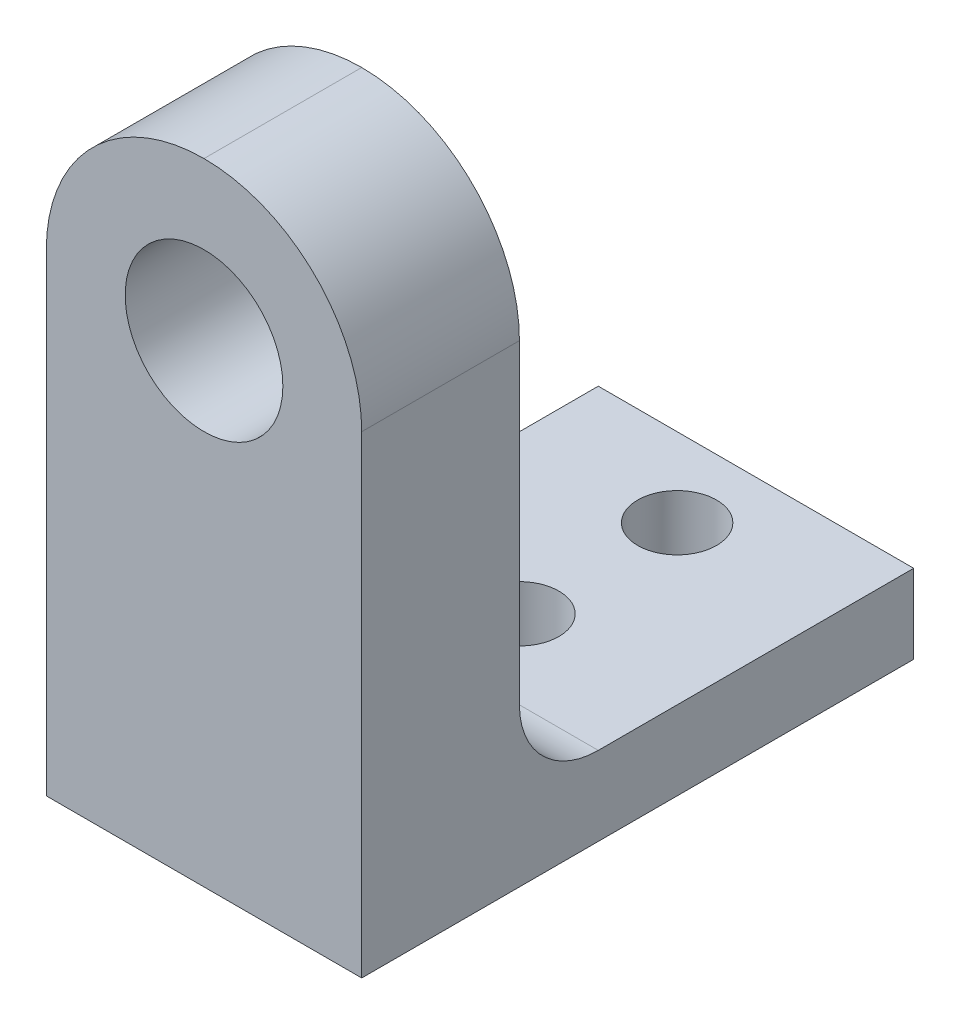
ISO-10303-21;
HEADER;
FILE_DESCRIPTION(('STEP AP214'),'2;1');
FILE_NAME('part.step','',(''),(''),'','','');
FILE_SCHEMA(('AUTOMOTIVE_DESIGN { 1 0 10303 214 1 1 1 1 }'));
ENDSEC;
DATA;
#1=APPLICATION_CONTEXT('core data for automotive mechanical design processes');
#2=APPLICATION_PROTOCOL_DEFINITION('international standard','automotive_design',2000,#1);
#3=PRODUCT_CONTEXT('',#1,'mechanical');
#4=PRODUCT('Part','Part','',(#3));
#5=PRODUCT_RELATED_PRODUCT_CATEGORY('part','',(#4));
#6=PRODUCT_DEFINITION_FORMATION('','',#4);
#7=PRODUCT_DEFINITION_CONTEXT('part definition',#1,'design');
#8=PRODUCT_DEFINITION('design','',#6,#7);
#9=PRODUCT_DEFINITION_SHAPE('','',#8);
#10=(LENGTH_UNIT() NAMED_UNIT(*) SI_UNIT(.MILLI.,.METRE.));
#11=(NAMED_UNIT(*) PLANE_ANGLE_UNIT() SI_UNIT($,.RADIAN.));
#12=(NAMED_UNIT(*) SI_UNIT($,.STERADIAN.) SOLID_ANGLE_UNIT());
#13=UNCERTAINTY_MEASURE_WITH_UNIT(LENGTH_MEASURE(1.E-05),#10,'distance_accuracy_value','');
#14=(GEOMETRIC_REPRESENTATION_CONTEXT(3) GLOBAL_UNCERTAINTY_ASSIGNED_CONTEXT((#13)) GLOBAL_UNIT_ASSIGNED_CONTEXT((#10,
#11,#12)) REPRESENTATION_CONTEXT('',''));
#15=CARTESIAN_POINT('',(0.,0.,0.));
#16=DIRECTION('',(0.,0.,1.));
#17=DIRECTION('',(1.,0.,0.));
#18=AXIS2_PLACEMENT_3D('',#15,#16,#17);
#19=CARTESIAN_POINT('',(25.4,12.7,-6.35));
#20=DIRECTION('',(-1.,0.,0.));
#21=DIRECTION('',(0.,0.,1.));
#22=AXIS2_PLACEMENT_3D('',#19,#20,#21);
#23=CYLINDRICAL_SURFACE('',#22,6.35);
#24=CARTESIAN_POINT('',(0.,12.7,-6.35));
#25=DIRECTION('',(1.,0.,0.));
#26=DIRECTION('',(0.,0.,-1.));
#27=AXIS2_PLACEMENT_3D('',#24,#25,#26);
#28=CIRCLE('',#27,6.35);
#29=CARTESIAN_POINT('',(0.,12.7,0.));
#30=VERTEX_POINT('',#29);
#31=CARTESIAN_POINT('',(0.,6.35,-6.35000000000004));
#32=VERTEX_POINT('',#31);
#33=EDGE_CURVE('E121',#30,#32,#28,.T.);
#34=ORIENTED_EDGE('',*,*,#33,.F.);
#35=DIRECTION('',(-1.,0.,0.));
#36=VECTOR('',#35,1.);
#37=CARTESIAN_POINT('',(25.4,12.7,0.));
#38=LINE('',#37,#36);
#39=CARTESIAN_POINT('',(25.4,12.7,0.));
#40=VERTEX_POINT('',#39);
#41=EDGE_CURVE('E115',#40,#30,#38,.T.);
#42=ORIENTED_EDGE('',*,*,#41,.F.);
#43=CARTESIAN_POINT('',(25.4,12.7,-6.35));
#44=DIRECTION('',(1.,0.,0.));
#45=DIRECTION('',(0.,0.,-1.));
#46=AXIS2_PLACEMENT_3D('',#43,#44,#45);
#47=CIRCLE('',#46,6.35);
#48=CARTESIAN_POINT('',(25.4,6.35,-6.35000000000004));
#49=VERTEX_POINT('',#48);
#50=EDGE_CURVE('E118',#40,#49,#47,.T.);
#51=ORIENTED_EDGE('',*,*,#50,.T.);
#52=DIRECTION('',(-1.,0.,0.));
#53=VECTOR('',#52,1.);
#54=CARTESIAN_POINT('',(25.4,6.35,-6.35000000000004));
#55=LINE('',#54,#53);
#56=EDGE_CURVE('E154',#49,#32,#55,.T.);
#57=ORIENTED_EDGE('',*,*,#56,.T.);
#58=EDGE_LOOP('',(#34,#42,#51,#57));
#59=FACE_BOUND('',#58,.T.);
#60=ADVANCED_FACE('F49',(#59),#23,.F.);
#61=CARTESIAN_POINT('',(25.4,0.,0.));
#62=DIRECTION('',(0.,0.,1.));
#63=DIRECTION('',(1.,0.,0.));
#64=AXIS2_PLACEMENT_3D('',#61,#62,#63);
#65=PLANE('',#64);
#66=CARTESIAN_POINT('',(12.7,38.1,0.));
#67=DIRECTION('',(0.,0.,1.));
#68=DIRECTION('',(1.,0.,0.));
#69=AXIS2_PLACEMENT_3D('',#66,#67,#68);
#70=CIRCLE('',#69,6.35);
#71=CARTESIAN_POINT('',(19.05,38.1,0.));
#72=VERTEX_POINT('',#71);
#73=EDGE_CURVE('E143',#72,#72,#70,.T.);
#74=ORIENTED_EDGE('',*,*,#73,.T.);
#75=EDGE_LOOP('',(#74));
#76=FACE_BOUND('',#75,.T.);
#77=CARTESIAN_POINT('',(12.7,38.1,0.));
#78=DIRECTION('',(0.,0.,1.));
#79=DIRECTION('',(1.,0.,0.));
#80=AXIS2_PLACEMENT_3D('',#77,#78,#79);
#81=CIRCLE('',#80,12.7);
#82=CARTESIAN_POINT('',(0.,38.1,0.));
#83=VERTEX_POINT('',#82);
#84=CARTESIAN_POINT('',(12.7,50.8,0.));
#85=VERTEX_POINT('',#84);
#86=EDGE_CURVE('E65',#83,#85,#81,.F.);
#87=ORIENTED_EDGE('',*,*,#86,.T.);
#88=CARTESIAN_POINT('',(12.7,38.1,0.));
#89=DIRECTION('',(0.,0.,1.));
#90=DIRECTION('',(1.,0.,0.));
#91=AXIS2_PLACEMENT_3D('',#88,#89,#90);
#92=CIRCLE('',#91,12.7);
#93=CARTESIAN_POINT('',(25.4,38.1,0.));
#94=VERTEX_POINT('',#93);
#95=EDGE_CURVE('E58',#85,#94,#92,.F.);
#96=ORIENTED_EDGE('',*,*,#95,.T.);
#97=DIRECTION('',(0.,1.,0.));
#98=VECTOR('',#97,1.);
#99=CARTESIAN_POINT('',(25.4,0.,0.));
#100=LINE('',#99,#98);
#101=EDGE_CURVE('E126',#40,#94,#100,.T.);
#102=ORIENTED_EDGE('',*,*,#101,.F.);
#103=ORIENTED_EDGE('',*,*,#41,.T.);
#104=DIRECTION('',(0.,1.,0.));
#105=VECTOR('',#104,1.);
#106=CARTESIAN_POINT('',(0.,0.,0.));
#107=LINE('',#106,#105);
#108=EDGE_CURVE('E156',#30,#83,#107,.T.);
#109=ORIENTED_EDGE('',*,*,#108,.T.);
#110=EDGE_LOOP('',(#87,#96,#102,#103,#109));
#111=FACE_BOUND('',#110,.T.);
#112=ADVANCED_FACE('F127',(#76,#111),#65,.F.);
#113=CARTESIAN_POINT('',(25.4,0.,12.7));
#114=DIRECTION('',(0.,0.,1.));
#115=DIRECTION('',(1.,0.,0.));
#116=AXIS2_PLACEMENT_3D('',#113,#114,#115);
#117=PLANE('',#116);
#118=CARTESIAN_POINT('',(12.7,38.1,12.7));
#119=DIRECTION('',(0.,0.,1.));
#120=DIRECTION('',(1.,0.,0.));
#121=AXIS2_PLACEMENT_3D('',#118,#119,#120);
#122=CIRCLE('',#121,6.35);
#123=CARTESIAN_POINT('',(19.05,38.1,12.7));
#124=VERTEX_POINT('',#123);
#125=EDGE_CURVE('E187',#124,#124,#122,.T.);
#126=ORIENTED_EDGE('',*,*,#125,.F.);
#127=EDGE_LOOP('',(#126));
#128=FACE_BOUND('',#127,.T.);
#129=DIRECTION('',(0.,1.,0.));
#130=VECTOR('',#129,1.);
#131=CARTESIAN_POINT('',(25.4,0.,12.7));
#132=LINE('',#131,#130);
#133=CARTESIAN_POINT('',(25.4,0.,12.7));
#134=VERTEX_POINT('',#133);
#135=CARTESIAN_POINT('',(25.4,38.1,12.7));
#136=VERTEX_POINT('',#135);
#137=EDGE_CURVE('E132',#134,#136,#132,.T.);
#138=ORIENTED_EDGE('',*,*,#137,.T.);
#139=CARTESIAN_POINT('',(12.7,38.1,12.7));
#140=DIRECTION('',(0.,0.,1.));
#141=DIRECTION('',(1.,0.,0.));
#142=AXIS2_PLACEMENT_3D('',#139,#140,#141);
#143=CIRCLE('',#142,12.7);
#144=CARTESIAN_POINT('',(12.7,50.8,12.7));
#145=VERTEX_POINT('',#144);
#146=EDGE_CURVE('E174',#136,#145,#143,.T.);
#147=ORIENTED_EDGE('',*,*,#146,.T.);
#148=CARTESIAN_POINT('',(12.7,38.1,12.7));
#149=DIRECTION('',(0.,0.,1.));
#150=DIRECTION('',(1.,0.,0.));
#151=AXIS2_PLACEMENT_3D('',#148,#149,#150);
#152=CIRCLE('',#151,12.7);
#153=CARTESIAN_POINT('',(0.,38.1,12.7));
#154=VERTEX_POINT('',#153);
#155=EDGE_CURVE('E172',#145,#154,#152,.T.);
#156=ORIENTED_EDGE('',*,*,#155,.T.);
#157=DIRECTION('',(0.,1.,0.));
#158=VECTOR('',#157,1.);
#159=CARTESIAN_POINT('',(0.,0.,12.7));
#160=LINE('',#159,#158);
#161=CARTESIAN_POINT('',(0.,0.,12.7));
#162=VERTEX_POINT('',#161);
#163=EDGE_CURVE('E158',#162,#154,#160,.T.);
#164=ORIENTED_EDGE('',*,*,#163,.F.);
#165=DIRECTION('',(-1.,0.,0.));
#166=VECTOR('',#165,1.);
#167=CARTESIAN_POINT('',(25.4,0.,12.7));
#168=LINE('',#167,#166);
#169=EDGE_CURVE('E123',#134,#162,#168,.T.);
#170=ORIENTED_EDGE('',*,*,#169,.F.);
#171=EDGE_LOOP('',(#138,#147,#156,#164,#170));
#172=FACE_BOUND('',#171,.T.);
#173=ADVANCED_FACE('F179',(#128,#172),#117,.T.);
#174=CARTESIAN_POINT('',(25.4,0.,0.));
#175=DIRECTION('',(0.,-1.,0.));
#176=DIRECTION('',(0.,0.,-1.));
#177=AXIS2_PLACEMENT_3D('',#174,#175,#176);
#178=PLANE('',#177);
#179=CARTESIAN_POINT('',(12.7,0.,-12.7));
#180=DIRECTION('',(0.,-1.,0.));
#181=DIRECTION('',(0.,0.,-1.));
#182=AXIS2_PLACEMENT_3D('',#179,#180,#181);
#183=CIRCLE('',#182,3.175);
#184=CARTESIAN_POINT('',(12.7,0.,-15.875));
#185=VERTEX_POINT('',#184);
#186=EDGE_CURVE('E200',#185,#185,#183,.T.);
#187=ORIENTED_EDGE('',*,*,#186,.F.);
#188=EDGE_LOOP('',(#187));
#189=FACE_BOUND('',#188,.T.);
#190=CARTESIAN_POINT('',(12.7,0.,-25.4));
#191=DIRECTION('',(0.,-1.,0.));
#192=DIRECTION('',(0.,0.,-1.));
#193=AXIS2_PLACEMENT_3D('',#190,#191,#192);
#194=CIRCLE('',#193,3.175);
#195=CARTESIAN_POINT('',(12.7,0.,-28.575));
#196=VERTEX_POINT('',#195);
#197=EDGE_CURVE('E191',#196,#196,#194,.T.);
#198=ORIENTED_EDGE('',*,*,#197,.F.);
#199=EDGE_LOOP('',(#198));
#200=FACE_BOUND('',#199,.T.);
#201=DIRECTION('',(0.,0.,1.));
#202=VECTOR('',#201,1.);
#203=CARTESIAN_POINT('',(0.,0.,0.));
#204=LINE('',#203,#202);
#205=CARTESIAN_POINT('',(0.,0.,-31.75));
#206=VERTEX_POINT('',#205);
#207=EDGE_CURVE('E160',#206,#162,#204,.T.);
#208=ORIENTED_EDGE('',*,*,#207,.F.);
#209=DIRECTION('',(-1.,0.,0.));
#210=VECTOR('',#209,1.);
#211=CARTESIAN_POINT('',(25.4,0.,-31.75));
#212=LINE('',#211,#210);
#213=CARTESIAN_POINT('',(25.4,0.,-31.75));
#214=VERTEX_POINT('',#213);
#215=EDGE_CURVE('E168',#214,#206,#212,.T.);
#216=ORIENTED_EDGE('',*,*,#215,.F.);
#217=DIRECTION('',(0.,0.,1.));
#218=VECTOR('',#217,1.);
#219=CARTESIAN_POINT('',(25.4,0.,0.));
#220=LINE('',#219,#218);
#221=EDGE_CURVE('E148',#214,#134,#220,.T.);
#222=ORIENTED_EDGE('',*,*,#221,.T.);
#223=ORIENTED_EDGE('',*,*,#169,.T.);
#224=EDGE_LOOP('',(#208,#216,#222,#223));
#225=FACE_BOUND('',#224,.T.);
#226=ADVANCED_FACE('F223',(#189,#200,#225),#178,.T.);
#227=CARTESIAN_POINT('',(25.4,0.,-31.75));
#228=DIRECTION('',(0.,0.,1.));
#229=DIRECTION('',(1.,0.,0.));
#230=AXIS2_PLACEMENT_3D('',#227,#228,#229);
#231=PLANE('',#230);
#232=DIRECTION('',(0.,1.,0.));
#233=VECTOR('',#232,1.);
#234=CARTESIAN_POINT('',(0.,0.,-31.75));
#235=LINE('',#234,#233);
#236=CARTESIAN_POINT('',(0.,6.35,-31.75));
#237=VERTEX_POINT('',#236);
#238=EDGE_CURVE('E140',#206,#237,#235,.T.);
#239=ORIENTED_EDGE('',*,*,#238,.T.);
#240=DIRECTION('',(-1.,0.,0.));
#241=VECTOR('',#240,1.);
#242=CARTESIAN_POINT('',(25.4,6.35,-31.75));
#243=LINE('',#242,#241);
#244=CARTESIAN_POINT('',(25.4,6.35,-31.75));
#245=VERTEX_POINT('',#244);
#246=EDGE_CURVE('E166',#245,#237,#243,.T.);
#247=ORIENTED_EDGE('',*,*,#246,.F.);
#248=DIRECTION('',(0.,1.,0.));
#249=VECTOR('',#248,1.);
#250=CARTESIAN_POINT('',(25.4,0.,-31.75));
#251=LINE('',#250,#249);
#252=EDGE_CURVE('E151',#214,#245,#251,.T.);
#253=ORIENTED_EDGE('',*,*,#252,.F.);
#254=ORIENTED_EDGE('',*,*,#215,.T.);
#255=EDGE_LOOP('',(#239,#247,#253,#254));
#256=FACE_BOUND('',#255,.T.);
#257=ADVANCED_FACE('F212',(#256),#231,.F.);
#258=CARTESIAN_POINT('',(25.4,6.35,0.));
#259=DIRECTION('',(0.,1.,0.));
#260=DIRECTION('',(0.,0.,1.));
#261=AXIS2_PLACEMENT_3D('',#258,#259,#260);
#262=PLANE('',#261);
#263=CARTESIAN_POINT('',(12.7,6.35,-12.7));
#264=DIRECTION('',(0.,1.,0.));
#265=DIRECTION('',(0.,0.,1.));
#266=AXIS2_PLACEMENT_3D('',#263,#264,#265);
#267=CIRCLE('',#266,3.175);
#268=CARTESIAN_POINT('',(12.7,6.35,-9.52500000000004));
#269=VERTEX_POINT('',#268);
#270=EDGE_CURVE('E203',#269,#269,#267,.T.);
#271=ORIENTED_EDGE('',*,*,#270,.F.);
#272=EDGE_LOOP('',(#271));
#273=FACE_BOUND('',#272,.T.);
#274=CARTESIAN_POINT('',(12.7,6.35,-25.4));
#275=DIRECTION('',(0.,1.,0.));
#276=DIRECTION('',(0.,0.,1.));
#277=AXIS2_PLACEMENT_3D('',#274,#275,#276);
#278=CIRCLE('',#277,3.175);
#279=CARTESIAN_POINT('',(12.7,6.35,-22.225));
#280=VERTEX_POINT('',#279);
#281=EDGE_CURVE('E195',#280,#280,#278,.T.);
#282=ORIENTED_EDGE('',*,*,#281,.F.);
#283=EDGE_LOOP('',(#282));
#284=FACE_BOUND('',#283,.T.);
#285=DIRECTION('',(0.,0.,-1.));
#286=VECTOR('',#285,1.);
#287=CARTESIAN_POINT('',(0.,6.35,0.));
#288=LINE('',#287,#286);
#289=EDGE_CURVE('E137',#32,#237,#288,.T.);
#290=ORIENTED_EDGE('',*,*,#289,.F.);
#291=ORIENTED_EDGE('',*,*,#56,.F.);
#292=DIRECTION('',(0.,0.,-1.));
#293=VECTOR('',#292,1.);
#294=CARTESIAN_POINT('',(25.4,6.35,0.));
#295=LINE('',#294,#293);
#296=EDGE_CURVE('E136',#49,#245,#295,.T.);
#297=ORIENTED_EDGE('',*,*,#296,.T.);
#298=ORIENTED_EDGE('',*,*,#246,.T.);
#299=EDGE_LOOP('',(#290,#291,#297,#298));
#300=FACE_BOUND('',#299,.T.);
#301=ADVANCED_FACE('F209',(#273,#284,#300),#262,.T.);
#302=CARTESIAN_POINT('',(25.4,0.,0.));
#303=DIRECTION('',(1.,0.,0.));
#304=DIRECTION('',(0.,0.,-1.));
#305=AXIS2_PLACEMENT_3D('',#302,#303,#304);
#306=PLANE('',#305);
#307=ORIENTED_EDGE('',*,*,#101,.T.);
#308=DIRECTION('',(0.,0.,1.));
#309=VECTOR('',#308,1.);
#310=CARTESIAN_POINT('',(25.4,38.1,12.7));
#311=LINE('',#310,#309);
#312=EDGE_CURVE('E122',#94,#136,#311,.T.);
#313=ORIENTED_EDGE('',*,*,#312,.T.);
#314=ORIENTED_EDGE('',*,*,#137,.F.);
#315=ORIENTED_EDGE('',*,*,#221,.F.);
#316=ORIENTED_EDGE('',*,*,#252,.T.);
#317=ORIENTED_EDGE('',*,*,#296,.F.);
#318=ORIENTED_EDGE('',*,*,#50,.F.);
#319=EDGE_LOOP('',(#307,#313,#314,#315,#316,#317,#318));
#320=FACE_BOUND('',#319,.T.);
#321=ADVANCED_FACE('F134',(#320),#306,.T.);
#322=CARTESIAN_POINT('',(0.,0.,0.));
#323=DIRECTION('',(1.,0.,0.));
#324=DIRECTION('',(0.,0.,-1.));
#325=AXIS2_PLACEMENT_3D('',#322,#323,#324);
#326=PLANE('',#325);
#327=ORIENTED_EDGE('',*,*,#163,.T.);
#328=DIRECTION('',(0.,0.,1.));
#329=VECTOR('',#328,1.);
#330=CARTESIAN_POINT('',(0.,38.1,0.));
#331=LINE('',#330,#329);
#332=EDGE_CURVE('E13',#154,#83,#331,.F.);
#333=ORIENTED_EDGE('',*,*,#332,.T.);
#334=ORIENTED_EDGE('',*,*,#108,.F.);
#335=ORIENTED_EDGE('',*,*,#33,.T.);
#336=ORIENTED_EDGE('',*,*,#289,.T.);
#337=ORIENTED_EDGE('',*,*,#238,.F.);
#338=ORIENTED_EDGE('',*,*,#207,.T.);
#339=EDGE_LOOP('',(#327,#333,#334,#335,#336,#337,#338));
#340=FACE_BOUND('',#339,.T.);
#341=ADVANCED_FACE('F219',(#340),#326,.F.);
#342=CARTESIAN_POINT('',(12.7,38.1,0.));
#343=DIRECTION('',(0.,0.,1.));
#344=DIRECTION('',(1.,0.,0.));
#345=AXIS2_PLACEMENT_3D('',#342,#343,#344);
#346=CYLINDRICAL_SURFACE('',#345,12.7);
#347=DIRECTION('',(0.,0.,1.));
#348=VECTOR('',#347,1.);
#349=CARTESIAN_POINT('',(12.7,50.8,0.));
#350=LINE('',#349,#348);
#351=EDGE_CURVE('E53',#85,#145,#350,.T.);
#352=ORIENTED_EDGE('',*,*,#351,.F.);
#353=ORIENTED_EDGE('',*,*,#86,.F.);
#354=ORIENTED_EDGE('',*,*,#332,.F.);
#355=ORIENTED_EDGE('',*,*,#155,.F.);
#356=EDGE_LOOP('',(#352,#353,#354,#355));
#357=FACE_BOUND('',#356,.T.);
#358=ADVANCED_FACE('F51',(#357),#346,.T.);
#359=CARTESIAN_POINT('',(12.7,38.1,0.));
#360=DIRECTION('',(0.,0.,-1.));
#361=DIRECTION('',(-1.,0.,0.));
#362=AXIS2_PLACEMENT_3D('',#359,#360,#361);
#363=CYLINDRICAL_SURFACE('',#362,12.7);
#364=ORIENTED_EDGE('',*,*,#95,.F.);
#365=ORIENTED_EDGE('',*,*,#351,.T.);
#366=ORIENTED_EDGE('',*,*,#146,.F.);
#367=ORIENTED_EDGE('',*,*,#312,.F.);
#368=EDGE_LOOP('',(#364,#365,#366,#367));
#369=FACE_BOUND('',#368,.T.);
#370=ADVANCED_FACE('F185',(#369),#363,.T.);
#371=CARTESIAN_POINT('',(12.7,38.1,-12.7));
#372=DIRECTION('',(0.,0.,1.));
#373=DIRECTION('',(1.,0.,0.));
#374=AXIS2_PLACEMENT_3D('',#371,#372,#373);
#375=CYLINDRICAL_SURFACE('',#374,6.35);
#376=ORIENTED_EDGE('',*,*,#125,.T.);
#377=EDGE_LOOP('',(#376));
#378=FACE_BOUND('',#377,.T.);
#379=ORIENTED_EDGE('',*,*,#73,.F.);
#380=EDGE_LOOP('',(#379));
#381=FACE_BOUND('',#380,.T.);
#382=ADVANCED_FACE('F241',(#378,#381),#375,.F.);
#383=CARTESIAN_POINT('',(12.7,-19.05,-25.4));
#384=DIRECTION('',(0.,1.,0.));
#385=DIRECTION('',(0.,0.,1.));
#386=AXIS2_PLACEMENT_3D('',#383,#384,#385);
#387=CYLINDRICAL_SURFACE('',#386,3.175);
#388=ORIENTED_EDGE('',*,*,#197,.T.);
#389=EDGE_LOOP('',(#388));
#390=FACE_BOUND('',#389,.T.);
#391=ORIENTED_EDGE('',*,*,#281,.T.);
#392=EDGE_LOOP('',(#391));
#393=FACE_BOUND('',#392,.T.);
#394=ADVANCED_FACE('F246',(#390,#393),#387,.F.);
#395=CARTESIAN_POINT('',(12.7,-19.05,-12.7));
#396=DIRECTION('',(0.,1.,0.));
#397=DIRECTION('',(0.,0.,1.));
#398=AXIS2_PLACEMENT_3D('',#395,#396,#397);
#399=CYLINDRICAL_SURFACE('',#398,3.175);
#400=ORIENTED_EDGE('',*,*,#186,.T.);
#401=EDGE_LOOP('',(#400));
#402=FACE_BOUND('',#401,.T.);
#403=ORIENTED_EDGE('',*,*,#270,.T.);
#404=EDGE_LOOP('',(#403));
#405=FACE_BOUND('',#404,.T.);
#406=ADVANCED_FACE('F207',(#402,#405),#399,.F.);
#407=CLOSED_SHELL('',(#60,#112,#173,#226,#257,#301,#321,#341,#358,#370,#382,#394,#406));
#408=MANIFOLD_SOLID_BREP('B2',#407);
#409=ADVANCED_BREP_SHAPE_REPRESENTATION('',(#18,#408),#14);
#410=SHAPE_DEFINITION_REPRESENTATION(#9,#409);
ENDSEC;
END-ISO-10303-21;
